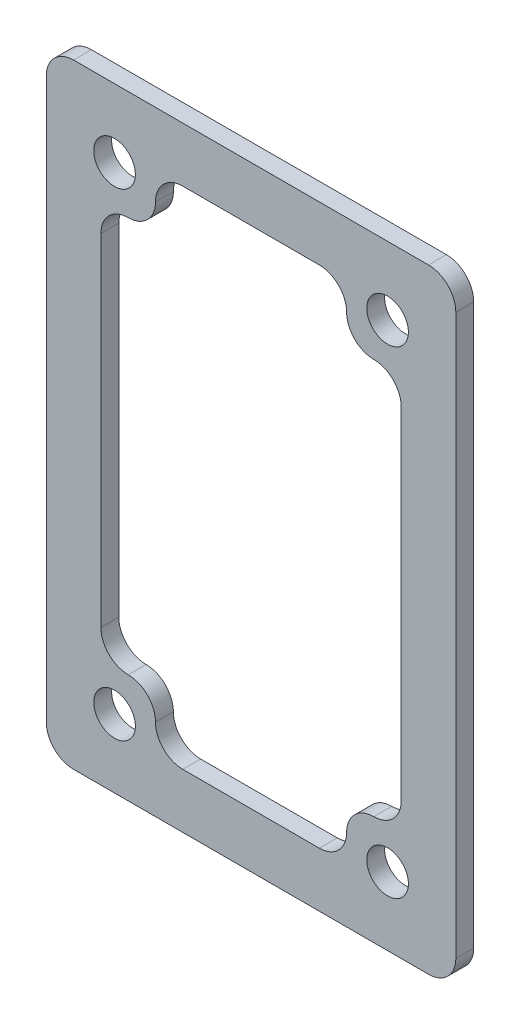
ISO-10303-21;
HEADER;
FILE_DESCRIPTION(('STEP AP214'),'2;1');
FILE_NAME('part.step','',(''),(''),'','','');
FILE_SCHEMA(('AUTOMOTIVE_DESIGN { 1 0 10303 214 1 1 1 1 }'));
ENDSEC;
DATA;
#1=APPLICATION_CONTEXT('core data for automotive mechanical design processes');
#2=APPLICATION_PROTOCOL_DEFINITION('international standard','automotive_design',2000,#1);
#3=PRODUCT_CONTEXT('',#1,'mechanical');
#4=PRODUCT('Part','Part','',(#3));
#5=PRODUCT_RELATED_PRODUCT_CATEGORY('part','',(#4));
#6=PRODUCT_DEFINITION_FORMATION('','',#4);
#7=PRODUCT_DEFINITION_CONTEXT('part definition',#1,'design');
#8=PRODUCT_DEFINITION('design','',#6,#7);
#9=PRODUCT_DEFINITION_SHAPE('','',#8);
#10=(LENGTH_UNIT() NAMED_UNIT(*) SI_UNIT(.MILLI.,.METRE.));
#11=(NAMED_UNIT(*) PLANE_ANGLE_UNIT() SI_UNIT($,.RADIAN.));
#12=(NAMED_UNIT(*) SI_UNIT($,.STERADIAN.) SOLID_ANGLE_UNIT());
#13=UNCERTAINTY_MEASURE_WITH_UNIT(LENGTH_MEASURE(1.E-05),#10,'distance_accuracy_value','');
#14=(GEOMETRIC_REPRESENTATION_CONTEXT(3) GLOBAL_UNCERTAINTY_ASSIGNED_CONTEXT((#13)) GLOBAL_UNIT_ASSIGNED_CONTEXT((#10,
#11,#12)) REPRESENTATION_CONTEXT('',''));
#15=CARTESIAN_POINT('',(0.,0.,0.));
#16=DIRECTION('',(0.,0.,1.));
#17=DIRECTION('',(1.,0.,0.));
#18=AXIS2_PLACEMENT_3D('',#15,#16,#17);
#19=CARTESIAN_POINT('',(15.,-22.5,1.31));
#20=DIRECTION('',(-1.,0.,0.));
#21=DIRECTION('',(0.,0.,1.));
#22=AXIS2_PLACEMENT_3D('',#19,#20,#21);
#23=PLANE('',#22);
#24=DIRECTION('',(0.,1.,0.));
#25=VECTOR('',#24,1.);
#26=CARTESIAN_POINT('',(15.,-22.5,1.31));
#27=LINE('',#26,#25);
#28=CARTESIAN_POINT('',(15.,-20.5,1.31));
#29=VERTEX_POINT('',#28);
#30=CARTESIAN_POINT('',(15.,20.5,1.31));
#31=VERTEX_POINT('',#30);
#32=EDGE_CURVE('E311',#29,#31,#27,.T.);
#33=ORIENTED_EDGE('',*,*,#32,.F.);
#34=DIRECTION('',(0.,0.,-1.));
#35=VECTOR('',#34,1.);
#36=CARTESIAN_POINT('',(15.,-20.5,1.31));
#37=LINE('',#36,#35);
#38=CARTESIAN_POINT('',(15.,-20.5,0.));
#39=VERTEX_POINT('',#38);
#40=EDGE_CURVE('E230',#29,#39,#37,.T.);
#41=ORIENTED_EDGE('',*,*,#40,.T.);
#42=DIRECTION('',(0.,1.,0.));
#43=VECTOR('',#42,1.);
#44=CARTESIAN_POINT('',(15.,-22.5,0.));
#45=LINE('',#44,#43);
#46=CARTESIAN_POINT('',(15.,20.5,0.));
#47=VERTEX_POINT('',#46);
#48=EDGE_CURVE('E301',#39,#47,#45,.T.);
#49=ORIENTED_EDGE('',*,*,#48,.T.);
#50=DIRECTION('',(0.,0.,-1.));
#51=VECTOR('',#50,1.);
#52=CARTESIAN_POINT('',(15.,20.5,1.31));
#53=LINE('',#52,#51);
#54=EDGE_CURVE('E227',#47,#31,#53,.F.);
#55=ORIENTED_EDGE('',*,*,#54,.T.);
#56=EDGE_LOOP('',(#33,#41,#49,#55));
#57=FACE_BOUND('',#56,.T.);
#58=ADVANCED_FACE('F35',(#57),#23,.F.);
#59=CARTESIAN_POINT('',(-15.,22.5,1.31));
#60=DIRECTION('',(0.,-1.,0.));
#61=DIRECTION('',(0.,0.,-1.));
#62=AXIS2_PLACEMENT_3D('',#59,#60,#61);
#63=PLANE('',#62);
#64=DIRECTION('',(-1.,0.,0.));
#65=VECTOR('',#64,1.);
#66=CARTESIAN_POINT('',(-15.,22.5,0.));
#67=LINE('',#66,#65);
#68=CARTESIAN_POINT('',(13.,22.5,0.));
#69=VERTEX_POINT('',#68);
#70=CARTESIAN_POINT('',(-13.,22.5,0.));
#71=VERTEX_POINT('',#70);
#72=EDGE_CURVE('E291',#69,#71,#67,.T.);
#73=ORIENTED_EDGE('',*,*,#72,.T.);
#74=DIRECTION('',(0.,0.,-1.));
#75=VECTOR('',#74,1.);
#76=CARTESIAN_POINT('',(-13.,22.5,1.31));
#77=LINE('',#76,#75);
#78=CARTESIAN_POINT('',(-13.,22.5,1.31));
#79=VERTEX_POINT('',#78);
#80=EDGE_CURVE('E11',#71,#79,#77,.F.);
#81=ORIENTED_EDGE('',*,*,#80,.T.);
#82=DIRECTION('',(-1.,0.,0.));
#83=VECTOR('',#82,1.);
#84=CARTESIAN_POINT('',(-15.,22.5,1.31));
#85=LINE('',#84,#83);
#86=CARTESIAN_POINT('',(13.,22.5,1.31));
#87=VERTEX_POINT('',#86);
#88=EDGE_CURVE('E293',#87,#79,#85,.T.);
#89=ORIENTED_EDGE('',*,*,#88,.F.);
#90=DIRECTION('',(0.,0.,-1.));
#91=VECTOR('',#90,1.);
#92=CARTESIAN_POINT('',(13.,22.5,1.31));
#93=LINE('',#92,#91);
#94=EDGE_CURVE('E43',#87,#69,#93,.T.);
#95=ORIENTED_EDGE('',*,*,#94,.T.);
#96=EDGE_LOOP('',(#73,#81,#89,#95));
#97=FACE_BOUND('',#96,.T.);
#98=ADVANCED_FACE('F290',(#97),#63,.F.);
#99=CARTESIAN_POINT('',(-15.,-22.5,1.31));
#100=DIRECTION('',(1.,0.,0.));
#101=DIRECTION('',(0.,0.,-1.));
#102=AXIS2_PLACEMENT_3D('',#99,#100,#101);
#103=PLANE('',#102);
#104=DIRECTION('',(0.,-1.,0.));
#105=VECTOR('',#104,1.);
#106=CARTESIAN_POINT('',(-15.,-22.5,0.));
#107=LINE('',#106,#105);
#108=CARTESIAN_POINT('',(-15.,20.5,0.));
#109=VERTEX_POINT('',#108);
#110=CARTESIAN_POINT('',(-15.,-20.5,0.));
#111=VERTEX_POINT('',#110);
#112=EDGE_CURVE('E300',#109,#111,#107,.T.);
#113=ORIENTED_EDGE('',*,*,#112,.T.);
#114=DIRECTION('',(0.,0.,-1.));
#115=VECTOR('',#114,1.);
#116=CARTESIAN_POINT('',(-15.,-20.5,1.31));
#117=LINE('',#116,#115);
#118=CARTESIAN_POINT('',(-15.,-20.5,1.31));
#119=VERTEX_POINT('',#118);
#120=EDGE_CURVE('E50',#111,#119,#117,.F.);
#121=ORIENTED_EDGE('',*,*,#120,.T.);
#122=DIRECTION('',(0.,-1.,0.));
#123=VECTOR('',#122,1.);
#124=CARTESIAN_POINT('',(-15.,-22.5,1.31));
#125=LINE('',#124,#123);
#126=CARTESIAN_POINT('',(-15.,20.5,1.31));
#127=VERTEX_POINT('',#126);
#128=EDGE_CURVE('E426',#127,#119,#125,.T.);
#129=ORIENTED_EDGE('',*,*,#128,.F.);
#130=DIRECTION('',(0.,0.,-1.));
#131=VECTOR('',#130,1.);
#132=CARTESIAN_POINT('',(-15.,20.5,1.31));
#133=LINE('',#132,#131);
#134=EDGE_CURVE('E281',#127,#109,#133,.T.);
#135=ORIENTED_EDGE('',*,*,#134,.T.);
#136=EDGE_LOOP('',(#113,#121,#129,#135));
#137=FACE_BOUND('',#136,.T.);
#138=ADVANCED_FACE('F444',(#137),#103,.F.);
#139=CARTESIAN_POINT('',(-15.,-22.5,1.31));
#140=DIRECTION('',(0.,1.,0.));
#141=DIRECTION('',(0.,0.,1.));
#142=AXIS2_PLACEMENT_3D('',#139,#140,#141);
#143=PLANE('',#142);
#144=DIRECTION('',(1.,0.,0.));
#145=VECTOR('',#144,1.);
#146=CARTESIAN_POINT('',(-15.,-22.5,0.));
#147=LINE('',#146,#145);
#148=CARTESIAN_POINT('',(-13.,-22.5,0.));
#149=VERTEX_POINT('',#148);
#150=CARTESIAN_POINT('',(13.,-22.5,0.));
#151=VERTEX_POINT('',#150);
#152=EDGE_CURVE('E303',#149,#151,#147,.T.);
#153=ORIENTED_EDGE('',*,*,#152,.T.);
#154=DIRECTION('',(0.,0.,-1.));
#155=VECTOR('',#154,1.);
#156=CARTESIAN_POINT('',(13.,-22.5,1.31));
#157=LINE('',#156,#155);
#158=CARTESIAN_POINT('',(13.,-22.5,1.31));
#159=VERTEX_POINT('',#158);
#160=EDGE_CURVE('E272',#151,#159,#157,.F.);
#161=ORIENTED_EDGE('',*,*,#160,.T.);
#162=DIRECTION('',(1.,0.,0.));
#163=VECTOR('',#162,1.);
#164=CARTESIAN_POINT('',(-15.,-22.5,1.31));
#165=LINE('',#164,#163);
#166=CARTESIAN_POINT('',(-13.,-22.5,1.31));
#167=VERTEX_POINT('',#166);
#168=EDGE_CURVE('E325',#167,#159,#165,.T.);
#169=ORIENTED_EDGE('',*,*,#168,.F.);
#170=DIRECTION('',(0.,0.,-1.));
#171=VECTOR('',#170,1.);
#172=CARTESIAN_POINT('',(-13.,-22.5,1.31));
#173=LINE('',#172,#171);
#174=EDGE_CURVE('E269',#167,#149,#173,.T.);
#175=ORIENTED_EDGE('',*,*,#174,.T.);
#176=EDGE_LOOP('',(#153,#161,#169,#175));
#177=FACE_BOUND('',#176,.T.);
#178=ADVANCED_FACE('F441',(#177),#143,.F.);
#179=CARTESIAN_POINT('',(0.,0.,1.31));
#180=DIRECTION('',(0.,0.,-1.));
#181=DIRECTION('',(-1.,0.,0.));
#182=AXIS2_PLACEMENT_3D('',#179,#180,#181);
#183=PLANE('',#182);
#184=DIRECTION('',(-1.,0.,0.));
#185=VECTOR('',#184,1.);
#186=CARTESIAN_POINT('',(-7.,18.5,1.31));
#187=LINE('',#186,#185);
#188=CARTESIAN_POINT('',(5.,18.5,1.31));
#189=VERTEX_POINT('',#188);
#190=CARTESIAN_POINT('',(-5.,18.5,1.31));
#191=VERTEX_POINT('',#190);
#192=EDGE_CURVE('E406',#189,#191,#187,.T.);
#193=ORIENTED_EDGE('',*,*,#192,.F.);
#194=CARTESIAN_POINT('',(5.,16.5,1.31));
#195=DIRECTION('',(0.,0.,-1.));
#196=DIRECTION('',(-1.,0.,0.));
#197=AXIS2_PLACEMENT_3D('',#194,#195,#196);
#198=CIRCLE('',#197,2.);
#199=CARTESIAN_POINT('',(7.,16.5,1.31));
#200=VERTEX_POINT('',#199);
#201=EDGE_CURVE('E374',#189,#200,#198,.T.);
#202=ORIENTED_EDGE('',*,*,#201,.T.);
#203=CARTESIAN_POINT('',(9.,16.5,1.31));
#204=DIRECTION('',(0.,0.,-1.));
#205=DIRECTION('',(-1.,0.,0.));
#206=AXIS2_PLACEMENT_3D('',#203,#204,#205);
#207=CIRCLE('',#206,2.);
#208=CARTESIAN_POINT('',(9.,14.5,1.31));
#209=VERTEX_POINT('',#208);
#210=EDGE_CURVE('E344',#200,#209,#207,.F.);
#211=ORIENTED_EDGE('',*,*,#210,.T.);
#212=CARTESIAN_POINT('',(9.,12.5,1.31));
#213=DIRECTION('',(0.,0.,-1.));
#214=DIRECTION('',(-1.,0.,0.));
#215=AXIS2_PLACEMENT_3D('',#212,#213,#214);
#216=CIRCLE('',#215,2.);
#217=CARTESIAN_POINT('',(11.,12.5,1.31));
#218=VERTEX_POINT('',#217);
#219=EDGE_CURVE('E370',#209,#218,#216,.T.);
#220=ORIENTED_EDGE('',*,*,#219,.T.);
#221=DIRECTION('',(0.,1.,0.));
#222=VECTOR('',#221,1.);
#223=CARTESIAN_POINT('',(11.,-14.5,1.31));
#224=LINE('',#223,#222);
#225=CARTESIAN_POINT('',(11.,-12.5,1.31));
#226=VERTEX_POINT('',#225);
#227=EDGE_CURVE('E242',#226,#218,#224,.T.);
#228=ORIENTED_EDGE('',*,*,#227,.F.);
#229=CARTESIAN_POINT('',(9.,-12.5,1.31));
#230=DIRECTION('',(0.,0.,-1.));
#231=DIRECTION('',(-1.,0.,0.));
#232=AXIS2_PLACEMENT_3D('',#229,#230,#231);
#233=CIRCLE('',#232,2.);
#234=CARTESIAN_POINT('',(9.,-14.5,1.31));
#235=VERTEX_POINT('',#234);
#236=EDGE_CURVE('E366',#226,#235,#233,.T.);
#237=ORIENTED_EDGE('',*,*,#236,.T.);
#238=CARTESIAN_POINT('',(9.,-16.5,1.31));
#239=DIRECTION('',(0.,0.,-1.));
#240=DIRECTION('',(-1.,0.,0.));
#241=AXIS2_PLACEMENT_3D('',#238,#239,#240);
#242=CIRCLE('',#241,2.);
#243=CARTESIAN_POINT('',(7.,-16.5,1.31));
#244=VERTEX_POINT('',#243);
#245=EDGE_CURVE('E338',#235,#244,#242,.F.);
#246=ORIENTED_EDGE('',*,*,#245,.T.);
#247=CARTESIAN_POINT('',(5.,-16.5,1.31));
#248=DIRECTION('',(0.,0.,-1.));
#249=DIRECTION('',(-1.,0.,0.));
#250=AXIS2_PLACEMENT_3D('',#247,#248,#249);
#251=CIRCLE('',#250,2.);
#252=CARTESIAN_POINT('',(5.,-18.5,1.31));
#253=VERTEX_POINT('',#252);
#254=EDGE_CURVE('E228',#244,#253,#251,.T.);
#255=ORIENTED_EDGE('',*,*,#254,.T.);
#256=DIRECTION('',(1.,0.,0.));
#257=VECTOR('',#256,1.);
#258=CARTESIAN_POINT('',(-6.99999999999999,-18.5,1.31));
#259=LINE('',#258,#257);
#260=CARTESIAN_POINT('',(-4.99999999999999,-18.5,1.31));
#261=VERTEX_POINT('',#260);
#262=EDGE_CURVE('E205',#261,#253,#259,.T.);
#263=ORIENTED_EDGE('',*,*,#262,.F.);
#264=CARTESIAN_POINT('',(-4.99999999999999,-16.5,1.31));
#265=DIRECTION('',(0.,0.,-1.));
#266=DIRECTION('',(-1.,0.,0.));
#267=AXIS2_PLACEMENT_3D('',#264,#265,#266);
#268=CIRCLE('',#267,2.);
#269=CARTESIAN_POINT('',(-6.99999999999999,-16.5,1.31));
#270=VERTEX_POINT('',#269);
#271=EDGE_CURVE('E363',#261,#270,#268,.T.);
#272=ORIENTED_EDGE('',*,*,#271,.T.);
#273=CARTESIAN_POINT('',(-8.99999999999999,-16.5,1.31));
#274=DIRECTION('',(0.,0.,-1.));
#275=DIRECTION('',(-1.,0.,0.));
#276=AXIS2_PLACEMENT_3D('',#273,#274,#275);
#277=CIRCLE('',#276,2.);
#278=CARTESIAN_POINT('',(-8.99999999999999,-14.5,1.31));
#279=VERTEX_POINT('',#278);
#280=EDGE_CURVE('E340',#270,#279,#277,.F.);
#281=ORIENTED_EDGE('',*,*,#280,.T.);
#282=CARTESIAN_POINT('',(-8.99999999999999,-12.5,1.31));
#283=DIRECTION('',(0.,0.,-1.));
#284=DIRECTION('',(-1.,0.,0.));
#285=AXIS2_PLACEMENT_3D('',#282,#283,#284);
#286=CIRCLE('',#285,2.);
#287=CARTESIAN_POINT('',(-11.,-12.5,1.31));
#288=VERTEX_POINT('',#287);
#289=EDGE_CURVE('E386',#279,#288,#286,.T.);
#290=ORIENTED_EDGE('',*,*,#289,.T.);
#291=DIRECTION('',(0.,-1.,0.));
#292=VECTOR('',#291,1.);
#293=CARTESIAN_POINT('',(-11.,-14.5,1.31));
#294=LINE('',#293,#292);
#295=CARTESIAN_POINT('',(-11.,12.5,1.31));
#296=VERTEX_POINT('',#295);
#297=EDGE_CURVE('E412',#296,#288,#294,.T.);
#298=ORIENTED_EDGE('',*,*,#297,.F.);
#299=CARTESIAN_POINT('',(-9.,12.5,1.31));
#300=DIRECTION('',(0.,0.,-1.));
#301=DIRECTION('',(-1.,0.,0.));
#302=AXIS2_PLACEMENT_3D('',#299,#300,#301);
#303=CIRCLE('',#302,2.);
#304=CARTESIAN_POINT('',(-9.,14.5,1.31));
#305=VERTEX_POINT('',#304);
#306=EDGE_CURVE('E382',#296,#305,#303,.T.);
#307=ORIENTED_EDGE('',*,*,#306,.T.);
#308=CARTESIAN_POINT('',(-9.,16.5,1.31));
#309=DIRECTION('',(0.,0.,-1.));
#310=DIRECTION('',(-1.,0.,0.));
#311=AXIS2_PLACEMENT_3D('',#308,#309,#310);
#312=CIRCLE('',#311,2.);
#313=CARTESIAN_POINT('',(-7.,16.5,1.31));
#314=VERTEX_POINT('',#313);
#315=EDGE_CURVE('E342',#305,#314,#312,.F.);
#316=ORIENTED_EDGE('',*,*,#315,.T.);
#317=CARTESIAN_POINT('',(-5.,16.5,1.31));
#318=DIRECTION('',(0.,0.,-1.));
#319=DIRECTION('',(-1.,0.,0.));
#320=AXIS2_PLACEMENT_3D('',#317,#318,#319);
#321=CIRCLE('',#320,2.);
#322=EDGE_CURVE('E378',#314,#191,#321,.T.);
#323=ORIENTED_EDGE('',*,*,#322,.T.);
#324=EDGE_LOOP('',(#193,#202,#211,#220,#228,#237,#246,#255,#263,#272,#281,#290,#298,#307,#316,#323));
#325=FACE_BOUND('',#324,.T.);
#326=CARTESIAN_POINT('',(10.,17.5,1.31));
#327=DIRECTION('',(0.,0.,1.));
#328=DIRECTION('',(1.,0.,0.));
#329=AXIS2_PLACEMENT_3D('',#326,#327,#328);
#330=CIRCLE('',#329,1.525);
#331=CARTESIAN_POINT('',(11.525,17.5,1.31));
#332=VERTEX_POINT('',#331);
#333=EDGE_CURVE('E416',#332,#332,#330,.T.);
#334=ORIENTED_EDGE('',*,*,#333,.F.);
#335=EDGE_LOOP('',(#334));
#336=FACE_BOUND('',#335,.T.);
#337=CARTESIAN_POINT('',(-9.99999999999999,-17.5,1.31));
#338=DIRECTION('',(0.,0.,1.));
#339=DIRECTION('',(1.,0.,0.));
#340=AXIS2_PLACEMENT_3D('',#337,#338,#339);
#341=CIRCLE('',#340,1.525);
#342=CARTESIAN_POINT('',(-8.47499999999999,-17.5,1.31));
#343=VERTEX_POINT('',#342);
#344=EDGE_CURVE('E409',#343,#343,#341,.T.);
#345=ORIENTED_EDGE('',*,*,#344,.F.);
#346=EDGE_LOOP('',(#345));
#347=FACE_BOUND('',#346,.T.);
#348=CARTESIAN_POINT('',(10.,-17.5,1.31));
#349=DIRECTION('',(0.,0.,1.));
#350=DIRECTION('',(1.,0.,0.));
#351=AXIS2_PLACEMENT_3D('',#348,#349,#350);
#352=CIRCLE('',#351,1.525);
#353=CARTESIAN_POINT('',(11.525,-17.5,1.31));
#354=VERTEX_POINT('',#353);
#355=EDGE_CURVE('E405',#354,#354,#352,.T.);
#356=ORIENTED_EDGE('',*,*,#355,.F.);
#357=EDGE_LOOP('',(#356));
#358=FACE_BOUND('',#357,.T.);
#359=CARTESIAN_POINT('',(-10.,17.5,1.31));
#360=DIRECTION('',(0.,0.,1.));
#361=DIRECTION('',(1.,0.,0.));
#362=AXIS2_PLACEMENT_3D('',#359,#360,#361);
#363=CIRCLE('',#362,1.525);
#364=CARTESIAN_POINT('',(-8.475,17.5,1.31));
#365=VERTEX_POINT('',#364);
#366=EDGE_CURVE('E316',#365,#365,#363,.T.);
#367=ORIENTED_EDGE('',*,*,#366,.F.);
#368=EDGE_LOOP('',(#367));
#369=FACE_BOUND('',#368,.T.);
#370=ORIENTED_EDGE('',*,*,#168,.T.);
#371=CARTESIAN_POINT('',(13.,-20.5,1.31));
#372=DIRECTION('',(0.,0.,-1.));
#373=DIRECTION('',(-1.,0.,0.));
#374=AXIS2_PLACEMENT_3D('',#371,#372,#373);
#375=CIRCLE('',#374,2.);
#376=EDGE_CURVE('E279',#159,#29,#375,.F.);
#377=ORIENTED_EDGE('',*,*,#376,.T.);
#378=ORIENTED_EDGE('',*,*,#32,.T.);
#379=CARTESIAN_POINT('',(13.,20.5,1.31));
#380=DIRECTION('',(0.,0.,-1.));
#381=DIRECTION('',(-1.,0.,0.));
#382=AXIS2_PLACEMENT_3D('',#379,#380,#381);
#383=CIRCLE('',#382,2.);
#384=EDGE_CURVE('E274',#31,#87,#383,.F.);
#385=ORIENTED_EDGE('',*,*,#384,.T.);
#386=ORIENTED_EDGE('',*,*,#88,.T.);
#387=CARTESIAN_POINT('',(-13.,20.5,1.31));
#388=DIRECTION('',(0.,0.,-1.));
#389=DIRECTION('',(-1.,0.,0.));
#390=AXIS2_PLACEMENT_3D('',#387,#388,#389);
#391=CIRCLE('',#390,2.);
#392=EDGE_CURVE('E57',#79,#127,#391,.F.);
#393=ORIENTED_EDGE('',*,*,#392,.T.);
#394=ORIENTED_EDGE('',*,*,#128,.T.);
#395=CARTESIAN_POINT('',(-13.,-20.5,1.31));
#396=DIRECTION('',(0.,0.,-1.));
#397=DIRECTION('',(-1.,0.,0.));
#398=AXIS2_PLACEMENT_3D('',#395,#396,#397);
#399=CIRCLE('',#398,2.);
#400=EDGE_CURVE('E277',#119,#167,#399,.F.);
#401=ORIENTED_EDGE('',*,*,#400,.T.);
#402=EDGE_LOOP('',(#370,#377,#378,#385,#386,#393,#394,#401));
#403=FACE_BOUND('',#402,.T.);
#404=ADVANCED_FACE('F403',(#325,#336,#347,#358,#369,#403),#183,.F.);
#405=CARTESIAN_POINT('',(0.,0.,0.));
#406=DIRECTION('',(0.,0.,-1.));
#407=DIRECTION('',(-1.,0.,0.));
#408=AXIS2_PLACEMENT_3D('',#405,#406,#407);
#409=PLANE('',#408);
#410=DIRECTION('',(0.,-1.,0.));
#411=VECTOR('',#410,1.);
#412=CARTESIAN_POINT('',(11.,0.,0.));
#413=LINE('',#412,#411);
#414=CARTESIAN_POINT('',(11.,12.5,0.));
#415=VERTEX_POINT('',#414);
#416=CARTESIAN_POINT('',(11.,-12.5,0.));
#417=VERTEX_POINT('',#416);
#418=EDGE_CURVE('E220',#415,#417,#413,.T.);
#419=ORIENTED_EDGE('',*,*,#418,.F.);
#420=CARTESIAN_POINT('',(9.,12.5,0.));
#421=DIRECTION('',(0.,0.,-1.));
#422=DIRECTION('',(-1.,0.,0.));
#423=AXIS2_PLACEMENT_3D('',#420,#421,#422);
#424=CIRCLE('',#423,2.);
#425=CARTESIAN_POINT('',(9.,14.5,0.));
#426=VERTEX_POINT('',#425);
#427=EDGE_CURVE('E372',#415,#426,#424,.F.);
#428=ORIENTED_EDGE('',*,*,#427,.T.);
#429=CARTESIAN_POINT('',(9.,16.5,0.));
#430=DIRECTION('',(0.,0.,-1.));
#431=DIRECTION('',(-1.,0.,0.));
#432=AXIS2_PLACEMENT_3D('',#429,#430,#431);
#433=CIRCLE('',#432,2.);
#434=CARTESIAN_POINT('',(7.,16.5,0.));
#435=VERTEX_POINT('',#434);
#436=EDGE_CURVE('E352',#426,#435,#433,.T.);
#437=ORIENTED_EDGE('',*,*,#436,.T.);
#438=CARTESIAN_POINT('',(5.,16.5,0.));
#439=DIRECTION('',(0.,0.,-1.));
#440=DIRECTION('',(-1.,0.,0.));
#441=AXIS2_PLACEMENT_3D('',#438,#439,#440);
#442=CIRCLE('',#441,2.);
#443=CARTESIAN_POINT('',(5.,18.5,0.));
#444=VERTEX_POINT('',#443);
#445=EDGE_CURVE('E376',#435,#444,#442,.F.);
#446=ORIENTED_EDGE('',*,*,#445,.T.);
#447=DIRECTION('',(1.,0.,0.));
#448=VECTOR('',#447,1.);
#449=CARTESIAN_POINT('',(0.,18.5,0.));
#450=LINE('',#449,#448);
#451=CARTESIAN_POINT('',(-5.,18.5,0.));
#452=VERTEX_POINT('',#451);
#453=EDGE_CURVE('E221',#452,#444,#450,.T.);
#454=ORIENTED_EDGE('',*,*,#453,.F.);
#455=CARTESIAN_POINT('',(-5.,16.5,0.));
#456=DIRECTION('',(0.,0.,-1.));
#457=DIRECTION('',(-1.,0.,0.));
#458=AXIS2_PLACEMENT_3D('',#455,#456,#457);
#459=CIRCLE('',#458,2.);
#460=CARTESIAN_POINT('',(-7.,16.5,0.));
#461=VERTEX_POINT('',#460);
#462=EDGE_CURVE('E380',#452,#461,#459,.F.);
#463=ORIENTED_EDGE('',*,*,#462,.T.);
#464=CARTESIAN_POINT('',(-9.,16.5,0.));
#465=DIRECTION('',(0.,0.,-1.));
#466=DIRECTION('',(-1.,0.,0.));
#467=AXIS2_PLACEMENT_3D('',#464,#465,#466);
#468=CIRCLE('',#467,2.);
#469=CARTESIAN_POINT('',(-9.,14.5,0.));
#470=VERTEX_POINT('',#469);
#471=EDGE_CURVE('E350',#461,#470,#468,.T.);
#472=ORIENTED_EDGE('',*,*,#471,.T.);
#473=CARTESIAN_POINT('',(-9.,12.5,0.));
#474=DIRECTION('',(0.,0.,-1.));
#475=DIRECTION('',(-1.,0.,0.));
#476=AXIS2_PLACEMENT_3D('',#473,#474,#475);
#477=CIRCLE('',#476,2.);
#478=CARTESIAN_POINT('',(-11.,12.5,0.));
#479=VERTEX_POINT('',#478);
#480=EDGE_CURVE('E384',#470,#479,#477,.F.);
#481=ORIENTED_EDGE('',*,*,#480,.T.);
#482=DIRECTION('',(0.,1.,0.));
#483=VECTOR('',#482,1.);
#484=CARTESIAN_POINT('',(-11.,0.,0.));
#485=LINE('',#484,#483);
#486=CARTESIAN_POINT('',(-11.,-12.5,0.));
#487=VERTEX_POINT('',#486);
#488=EDGE_CURVE('E210',#487,#479,#485,.T.);
#489=ORIENTED_EDGE('',*,*,#488,.F.);
#490=CARTESIAN_POINT('',(-8.99999999999999,-12.5,0.));
#491=DIRECTION('',(0.,0.,-1.));
#492=DIRECTION('',(-1.,0.,0.));
#493=AXIS2_PLACEMENT_3D('',#490,#491,#492);
#494=CIRCLE('',#493,2.);
#495=CARTESIAN_POINT('',(-8.99999999999999,-14.5,0.));
#496=VERTEX_POINT('',#495);
#497=EDGE_CURVE('E232',#487,#496,#494,.F.);
#498=ORIENTED_EDGE('',*,*,#497,.T.);
#499=CARTESIAN_POINT('',(-8.99999999999999,-16.5,0.));
#500=DIRECTION('',(0.,0.,-1.));
#501=DIRECTION('',(-1.,0.,0.));
#502=AXIS2_PLACEMENT_3D('',#499,#500,#501);
#503=CIRCLE('',#502,2.);
#504=CARTESIAN_POINT('',(-6.99999999999999,-16.5,0.));
#505=VERTEX_POINT('',#504);
#506=EDGE_CURVE('E348',#496,#505,#503,.T.);
#507=ORIENTED_EDGE('',*,*,#506,.T.);
#508=CARTESIAN_POINT('',(-4.99999999999999,-16.5,0.));
#509=DIRECTION('',(0.,0.,-1.));
#510=DIRECTION('',(-1.,0.,0.));
#511=AXIS2_PLACEMENT_3D('',#508,#509,#510);
#512=CIRCLE('',#511,2.);
#513=CARTESIAN_POINT('',(-4.99999999999999,-18.5,0.));
#514=VERTEX_POINT('',#513);
#515=EDGE_CURVE('E219',#505,#514,#512,.F.);
#516=ORIENTED_EDGE('',*,*,#515,.T.);
#517=DIRECTION('',(-1.,0.,0.));
#518=VECTOR('',#517,1.);
#519=CARTESIAN_POINT('',(0.,-18.5,0.));
#520=LINE('',#519,#518);
#521=CARTESIAN_POINT('',(5.,-18.5,0.));
#522=VERTEX_POINT('',#521);
#523=EDGE_CURVE('E202',#522,#514,#520,.T.);
#524=ORIENTED_EDGE('',*,*,#523,.F.);
#525=CARTESIAN_POINT('',(5.,-16.5,0.));
#526=DIRECTION('',(0.,0.,-1.));
#527=DIRECTION('',(-1.,0.,0.));
#528=AXIS2_PLACEMENT_3D('',#525,#526,#527);
#529=CIRCLE('',#528,2.);
#530=CARTESIAN_POINT('',(7.,-16.5,0.));
#531=VERTEX_POINT('',#530);
#532=EDGE_CURVE('E216',#522,#531,#529,.F.);
#533=ORIENTED_EDGE('',*,*,#532,.T.);
#534=CARTESIAN_POINT('',(9.,-16.5,0.));
#535=DIRECTION('',(0.,0.,-1.));
#536=DIRECTION('',(-1.,0.,0.));
#537=AXIS2_PLACEMENT_3D('',#534,#535,#536);
#538=CIRCLE('',#537,2.);
#539=CARTESIAN_POINT('',(9.,-14.5,0.));
#540=VERTEX_POINT('',#539);
#541=EDGE_CURVE('E346',#531,#540,#538,.T.);
#542=ORIENTED_EDGE('',*,*,#541,.T.);
#543=CARTESIAN_POINT('',(9.,-12.5,0.));
#544=DIRECTION('',(0.,0.,-1.));
#545=DIRECTION('',(-1.,0.,0.));
#546=AXIS2_PLACEMENT_3D('',#543,#544,#545);
#547=CIRCLE('',#546,2.);
#548=EDGE_CURVE('E368',#540,#417,#547,.F.);
#549=ORIENTED_EDGE('',*,*,#548,.T.);
#550=EDGE_LOOP('',(#419,#428,#437,#446,#454,#463,#472,#481,#489,#498,#507,#516,#524,#533,#542,#549));
#551=FACE_BOUND('',#550,.T.);
#552=CARTESIAN_POINT('',(10.,17.5,0.));
#553=DIRECTION('',(0.,0.,-1.));
#554=DIRECTION('',(-1.,0.,0.));
#555=AXIS2_PLACEMENT_3D('',#552,#553,#554);
#556=CIRCLE('',#555,1.525);
#557=CARTESIAN_POINT('',(8.475,17.5,0.));
#558=VERTEX_POINT('',#557);
#559=EDGE_CURVE('E305',#558,#558,#556,.T.);
#560=ORIENTED_EDGE('',*,*,#559,.F.);
#561=EDGE_LOOP('',(#560));
#562=FACE_BOUND('',#561,.T.);
#563=CARTESIAN_POINT('',(-9.99999999999999,-17.5,0.));
#564=DIRECTION('',(0.,0.,-1.));
#565=DIRECTION('',(-1.,0.,0.));
#566=AXIS2_PLACEMENT_3D('',#563,#564,#565);
#567=CIRCLE('',#566,1.525);
#568=CARTESIAN_POINT('',(-11.525,-17.5,0.));
#569=VERTEX_POINT('',#568);
#570=EDGE_CURVE('E319',#569,#569,#567,.T.);
#571=ORIENTED_EDGE('',*,*,#570,.F.);
#572=EDGE_LOOP('',(#571));
#573=FACE_BOUND('',#572,.T.);
#574=CARTESIAN_POINT('',(10.,-17.5,0.));
#575=DIRECTION('',(0.,0.,-1.));
#576=DIRECTION('',(-1.,0.,0.));
#577=AXIS2_PLACEMENT_3D('',#574,#575,#576);
#578=CIRCLE('',#577,1.525);
#579=CARTESIAN_POINT('',(8.475,-17.5,0.));
#580=VERTEX_POINT('',#579);
#581=EDGE_CURVE('E315',#580,#580,#578,.T.);
#582=ORIENTED_EDGE('',*,*,#581,.F.);
#583=EDGE_LOOP('',(#582));
#584=FACE_BOUND('',#583,.T.);
#585=CARTESIAN_POINT('',(-10.,17.5,0.));
#586=DIRECTION('',(0.,0.,-1.));
#587=DIRECTION('',(-1.,0.,0.));
#588=AXIS2_PLACEMENT_3D('',#585,#586,#587);
#589=CIRCLE('',#588,1.525);
#590=CARTESIAN_POINT('',(-11.525,17.5,0.));
#591=VERTEX_POINT('',#590);
#592=EDGE_CURVE('E312',#591,#591,#589,.T.);
#593=ORIENTED_EDGE('',*,*,#592,.F.);
#594=EDGE_LOOP('',(#593));
#595=FACE_BOUND('',#594,.T.);
#596=ORIENTED_EDGE('',*,*,#48,.F.);
#597=CARTESIAN_POINT('',(13.,-20.5,0.));
#598=DIRECTION('',(0.,0.,-1.));
#599=DIRECTION('',(-1.,0.,0.));
#600=AXIS2_PLACEMENT_3D('',#597,#598,#599);
#601=CIRCLE('',#600,2.);
#602=EDGE_CURVE('E267',#39,#151,#601,.T.);
#603=ORIENTED_EDGE('',*,*,#602,.T.);
#604=ORIENTED_EDGE('',*,*,#152,.F.);
#605=CARTESIAN_POINT('',(-13.,-20.5,0.));
#606=DIRECTION('',(0.,0.,-1.));
#607=DIRECTION('',(-1.,0.,0.));
#608=AXIS2_PLACEMENT_3D('',#605,#606,#607);
#609=CIRCLE('',#608,2.);
#610=EDGE_CURVE('E265',#149,#111,#609,.T.);
#611=ORIENTED_EDGE('',*,*,#610,.T.);
#612=ORIENTED_EDGE('',*,*,#112,.F.);
#613=CARTESIAN_POINT('',(-13.,20.5,0.));
#614=DIRECTION('',(0.,0.,-1.));
#615=DIRECTION('',(-1.,0.,0.));
#616=AXIS2_PLACEMENT_3D('',#613,#614,#615);
#617=CIRCLE('',#616,2.);
#618=EDGE_CURVE('E263',#109,#71,#617,.T.);
#619=ORIENTED_EDGE('',*,*,#618,.T.);
#620=ORIENTED_EDGE('',*,*,#72,.F.);
#621=CARTESIAN_POINT('',(13.,20.5,0.));
#622=DIRECTION('',(0.,0.,-1.));
#623=DIRECTION('',(-1.,0.,0.));
#624=AXIS2_PLACEMENT_3D('',#621,#622,#623);
#625=CIRCLE('',#624,2.);
#626=EDGE_CURVE('E261',#69,#47,#625,.T.);
#627=ORIENTED_EDGE('',*,*,#626,.T.);
#628=EDGE_LOOP('',(#596,#603,#604,#611,#612,#619,#620,#627));
#629=FACE_BOUND('',#628,.T.);
#630=ADVANCED_FACE('F214',(#551,#562,#573,#584,#595,#629),#409,.T.);
#631=CARTESIAN_POINT('',(-10.,17.5,-8.69));
#632=DIRECTION('',(0.,0.,1.));
#633=DIRECTION('',(1.,0.,0.));
#634=AXIS2_PLACEMENT_3D('',#631,#632,#633);
#635=CYLINDRICAL_SURFACE('',#634,1.525);
#636=ORIENTED_EDGE('',*,*,#592,.T.);
#637=EDGE_LOOP('',(#636));
#638=FACE_BOUND('',#637,.T.);
#639=ORIENTED_EDGE('',*,*,#366,.T.);
#640=EDGE_LOOP('',(#639));
#641=FACE_BOUND('',#640,.T.);
#642=ADVANCED_FACE('F645',(#638,#641),#635,.F.);
#643=CARTESIAN_POINT('',(10.,-17.5,-8.69));
#644=DIRECTION('',(0.,0.,1.));
#645=DIRECTION('',(1.,0.,0.));
#646=AXIS2_PLACEMENT_3D('',#643,#644,#645);
#647=CYLINDRICAL_SURFACE('',#646,1.525);
#648=ORIENTED_EDGE('',*,*,#581,.T.);
#649=EDGE_LOOP('',(#648));
#650=FACE_BOUND('',#649,.T.);
#651=ORIENTED_EDGE('',*,*,#355,.T.);
#652=EDGE_LOOP('',(#651));
#653=FACE_BOUND('',#652,.T.);
#654=ADVANCED_FACE('F636',(#650,#653),#647,.F.);
#655=CARTESIAN_POINT('',(-9.99999999999999,-17.5,-8.69));
#656=DIRECTION('',(0.,0.,1.));
#657=DIRECTION('',(1.,0.,0.));
#658=AXIS2_PLACEMENT_3D('',#655,#656,#657);
#659=CYLINDRICAL_SURFACE('',#658,1.525);
#660=ORIENTED_EDGE('',*,*,#570,.T.);
#661=EDGE_LOOP('',(#660));
#662=FACE_BOUND('',#661,.T.);
#663=ORIENTED_EDGE('',*,*,#344,.T.);
#664=EDGE_LOOP('',(#663));
#665=FACE_BOUND('',#664,.T.);
#666=ADVANCED_FACE('F627',(#662,#665),#659,.F.);
#667=CARTESIAN_POINT('',(10.,17.5,-8.69));
#668=DIRECTION('',(0.,0.,1.));
#669=DIRECTION('',(1.,0.,0.));
#670=AXIS2_PLACEMENT_3D('',#667,#668,#669);
#671=CYLINDRICAL_SURFACE('',#670,1.525);
#672=ORIENTED_EDGE('',*,*,#559,.T.);
#673=EDGE_LOOP('',(#672));
#674=FACE_BOUND('',#673,.T.);
#675=ORIENTED_EDGE('',*,*,#333,.T.);
#676=EDGE_LOOP('',(#675));
#677=FACE_BOUND('',#676,.T.);
#678=ADVANCED_FACE('F619',(#674,#677),#671,.F.);
#679=CARTESIAN_POINT('',(-6.99999999999999,-18.5,-8.69));
#680=DIRECTION('',(0.,-1.,0.));
#681=DIRECTION('',(0.,0.,-1.));
#682=AXIS2_PLACEMENT_3D('',#679,#680,#681);
#683=PLANE('',#682);
#684=ORIENTED_EDGE('',*,*,#523,.T.);
#685=DIRECTION('',(0.,0.,1.));
#686=VECTOR('',#685,1.);
#687=CARTESIAN_POINT('',(-4.99999999999999,-18.5,1.31));
#688=LINE('',#687,#686);
#689=EDGE_CURVE('E209',#514,#261,#688,.T.);
#690=ORIENTED_EDGE('',*,*,#689,.T.);
#691=ORIENTED_EDGE('',*,*,#262,.T.);
#692=DIRECTION('',(0.,0.,1.));
#693=VECTOR('',#692,1.);
#694=CARTESIAN_POINT('',(5.,-18.5,0.));
#695=LINE('',#694,#693);
#696=EDGE_CURVE('E198',#253,#522,#695,.F.);
#697=ORIENTED_EDGE('',*,*,#696,.T.);
#698=EDGE_LOOP('',(#684,#690,#691,#697));
#699=FACE_BOUND('',#698,.T.);
#700=ADVANCED_FACE('F200',(#699),#683,.F.);
#701=CARTESIAN_POINT('',(-7.,18.5,-8.69));
#702=DIRECTION('',(0.,1.,0.));
#703=DIRECTION('',(0.,0.,1.));
#704=AXIS2_PLACEMENT_3D('',#701,#702,#703);
#705=PLANE('',#704);
#706=ORIENTED_EDGE('',*,*,#453,.T.);
#707=DIRECTION('',(0.,0.,1.));
#708=VECTOR('',#707,1.);
#709=CARTESIAN_POINT('',(5.,18.5,1.31));
#710=LINE('',#709,#708);
#711=EDGE_CURVE('E357',#444,#189,#710,.T.);
#712=ORIENTED_EDGE('',*,*,#711,.T.);
#713=ORIENTED_EDGE('',*,*,#192,.T.);
#714=DIRECTION('',(0.,0.,1.));
#715=VECTOR('',#714,1.);
#716=CARTESIAN_POINT('',(-5.,18.5,0.));
#717=LINE('',#716,#715);
#718=EDGE_CURVE('E354',#191,#452,#717,.F.);
#719=ORIENTED_EDGE('',*,*,#718,.T.);
#720=EDGE_LOOP('',(#706,#712,#713,#719));
#721=FACE_BOUND('',#720,.T.);
#722=ADVANCED_FACE('F602',(#721),#705,.F.);
#723=CARTESIAN_POINT('',(-11.,-14.5,-8.69));
#724=DIRECTION('',(-1.,0.,0.));
#725=DIRECTION('',(0.,-1.,0.));
#726=AXIS2_PLACEMENT_3D('',#723,#724,#725);
#727=PLANE('',#726);
#728=ORIENTED_EDGE('',*,*,#488,.T.);
#729=DIRECTION('',(0.,0.,1.));
#730=VECTOR('',#729,1.);
#731=CARTESIAN_POINT('',(-11.,12.5,1.31));
#732=LINE('',#731,#730);
#733=EDGE_CURVE('E361',#479,#296,#732,.T.);
#734=ORIENTED_EDGE('',*,*,#733,.T.);
#735=ORIENTED_EDGE('',*,*,#297,.T.);
#736=DIRECTION('',(0.,0.,1.));
#737=VECTOR('',#736,1.);
#738=CARTESIAN_POINT('',(-11.,-12.5,0.));
#739=LINE('',#738,#737);
#740=EDGE_CURVE('E359',#288,#487,#739,.F.);
#741=ORIENTED_EDGE('',*,*,#740,.T.);
#742=EDGE_LOOP('',(#728,#734,#735,#741));
#743=FACE_BOUND('',#742,.T.);
#744=ADVANCED_FACE('F593',(#743),#727,.F.);
#745=CARTESIAN_POINT('',(11.,-14.5,-8.69));
#746=DIRECTION('',(1.,0.,0.));
#747=DIRECTION('',(0.,0.,-1.));
#748=AXIS2_PLACEMENT_3D('',#745,#746,#747);
#749=PLANE('',#748);
#750=ORIENTED_EDGE('',*,*,#418,.T.);
#751=DIRECTION('',(0.,0.,1.));
#752=VECTOR('',#751,1.);
#753=CARTESIAN_POINT('',(11.,-12.5,1.31));
#754=LINE('',#753,#752);
#755=EDGE_CURVE('E335',#417,#226,#754,.T.);
#756=ORIENTED_EDGE('',*,*,#755,.T.);
#757=ORIENTED_EDGE('',*,*,#227,.T.);
#758=DIRECTION('',(0.,0.,1.));
#759=VECTOR('',#758,1.);
#760=CARTESIAN_POINT('',(11.,12.5,0.));
#761=LINE('',#760,#759);
#762=EDGE_CURVE('E332',#218,#415,#761,.F.);
#763=ORIENTED_EDGE('',*,*,#762,.T.);
#764=EDGE_LOOP('',(#750,#756,#757,#763));
#765=FACE_BOUND('',#764,.T.);
#766=ADVANCED_FACE('F466',(#765),#749,.F.);
#767=CARTESIAN_POINT('',(-8.99999999999999,-12.5,-8.69));
#768=DIRECTION('',(0.,0.,-1.));
#769=DIRECTION('',(-1.,0.,0.));
#770=AXIS2_PLACEMENT_3D('',#767,#768,#769);
#771=CYLINDRICAL_SURFACE('',#770,2.);
#772=ORIENTED_EDGE('',*,*,#740,.F.);
#773=ORIENTED_EDGE('',*,*,#289,.F.);
#774=DIRECTION('',(0.,0.,1.));
#775=VECTOR('',#774,1.);
#776=CARTESIAN_POINT('',(-8.99999999999999,-14.5,1.31));
#777=LINE('',#776,#775);
#778=EDGE_CURVE('E239',#496,#279,#777,.T.);
#779=ORIENTED_EDGE('',*,*,#778,.F.);
#780=ORIENTED_EDGE('',*,*,#497,.F.);
#781=EDGE_LOOP('',(#772,#773,#779,#780));
#782=FACE_BOUND('',#781,.T.);
#783=ADVANCED_FACE('F395',(#782),#771,.F.);
#784=CARTESIAN_POINT('',(-8.99999999999999,-16.5,-8.69));
#785=DIRECTION('',(0.,0.,1.));
#786=DIRECTION('',(1.,0.,0.));
#787=AXIS2_PLACEMENT_3D('',#784,#785,#786);
#788=CYLINDRICAL_SURFACE('',#787,2.);
#789=DIRECTION('',(0.,0.,1.));
#790=VECTOR('',#789,1.);
#791=CARTESIAN_POINT('',(-6.99999999999999,-16.5,-8.69));
#792=LINE('',#791,#790);
#793=EDGE_CURVE('E236',#505,#270,#792,.T.);
#794=ORIENTED_EDGE('',*,*,#793,.F.);
#795=ORIENTED_EDGE('',*,*,#506,.F.);
#796=ORIENTED_EDGE('',*,*,#778,.T.);
#797=ORIENTED_EDGE('',*,*,#280,.F.);
#798=EDGE_LOOP('',(#794,#795,#796,#797));
#799=FACE_BOUND('',#798,.T.);
#800=ADVANCED_FACE('F398',(#799),#788,.T.);
#801=CARTESIAN_POINT('',(-4.99999999999999,-16.5,-8.69));
#802=DIRECTION('',(0.,0.,-1.));
#803=DIRECTION('',(-1.,0.,0.));
#804=AXIS2_PLACEMENT_3D('',#801,#802,#803);
#805=CYLINDRICAL_SURFACE('',#804,2.);
#806=ORIENTED_EDGE('',*,*,#515,.F.);
#807=ORIENTED_EDGE('',*,*,#793,.T.);
#808=ORIENTED_EDGE('',*,*,#271,.F.);
#809=ORIENTED_EDGE('',*,*,#689,.F.);
#810=EDGE_LOOP('',(#806,#807,#808,#809));
#811=FACE_BOUND('',#810,.T.);
#812=ADVANCED_FACE('F400',(#811),#805,.F.);
#813=CARTESIAN_POINT('',(5.,-16.5,-8.69));
#814=DIRECTION('',(0.,0.,-1.));
#815=DIRECTION('',(-1.,0.,0.));
#816=AXIS2_PLACEMENT_3D('',#813,#814,#815);
#817=CYLINDRICAL_SURFACE('',#816,2.);
#818=ORIENTED_EDGE('',*,*,#696,.F.);
#819=ORIENTED_EDGE('',*,*,#254,.F.);
#820=DIRECTION('',(0.,0.,1.));
#821=VECTOR('',#820,1.);
#822=CARTESIAN_POINT('',(7.,-16.5,1.31));
#823=LINE('',#822,#821);
#824=EDGE_CURVE('E225',#531,#244,#823,.T.);
#825=ORIENTED_EDGE('',*,*,#824,.F.);
#826=ORIENTED_EDGE('',*,*,#532,.F.);
#827=EDGE_LOOP('',(#818,#819,#825,#826));
#828=FACE_BOUND('',#827,.T.);
#829=ADVANCED_FACE('F223',(#828),#817,.F.);
#830=CARTESIAN_POINT('',(9.,-16.5,-8.69));
#831=DIRECTION('',(0.,0.,-1.));
#832=DIRECTION('',(-1.,0.,0.));
#833=AXIS2_PLACEMENT_3D('',#830,#831,#832);
#834=CYLINDRICAL_SURFACE('',#833,2.);
#835=DIRECTION('',(0.,0.,-1.));
#836=VECTOR('',#835,1.);
#837=CARTESIAN_POINT('',(9.,-14.5,-8.69));
#838=LINE('',#837,#836);
#839=EDGE_CURVE('E243',#540,#235,#838,.F.);
#840=ORIENTED_EDGE('',*,*,#839,.F.);
#841=ORIENTED_EDGE('',*,*,#541,.F.);
#842=ORIENTED_EDGE('',*,*,#824,.T.);
#843=ORIENTED_EDGE('',*,*,#245,.F.);
#844=EDGE_LOOP('',(#840,#841,#842,#843));
#845=FACE_BOUND('',#844,.T.);
#846=ADVANCED_FACE('F471',(#845),#834,.T.);
#847=CARTESIAN_POINT('',(9.,-12.5,-8.69));
#848=DIRECTION('',(0.,0.,-1.));
#849=DIRECTION('',(-1.,0.,0.));
#850=AXIS2_PLACEMENT_3D('',#847,#848,#849);
#851=CYLINDRICAL_SURFACE('',#850,2.);
#852=ORIENTED_EDGE('',*,*,#548,.F.);
#853=ORIENTED_EDGE('',*,*,#839,.T.);
#854=ORIENTED_EDGE('',*,*,#236,.F.);
#855=ORIENTED_EDGE('',*,*,#755,.F.);
#856=EDGE_LOOP('',(#852,#853,#854,#855));
#857=FACE_BOUND('',#856,.T.);
#858=ADVANCED_FACE('F467',(#857),#851,.F.);
#859=CARTESIAN_POINT('',(5.,16.5,-8.69));
#860=DIRECTION('',(0.,0.,-1.));
#861=DIRECTION('',(-1.,0.,0.));
#862=AXIS2_PLACEMENT_3D('',#859,#860,#861);
#863=CYLINDRICAL_SURFACE('',#862,2.);
#864=ORIENTED_EDGE('',*,*,#711,.F.);
#865=ORIENTED_EDGE('',*,*,#445,.F.);
#866=DIRECTION('',(0.,0.,1.));
#867=VECTOR('',#866,1.);
#868=CARTESIAN_POINT('',(7.,16.5,0.));
#869=LINE('',#868,#867);
#870=EDGE_CURVE('E246',#200,#435,#869,.F.);
#871=ORIENTED_EDGE('',*,*,#870,.F.);
#872=ORIENTED_EDGE('',*,*,#201,.F.);
#873=EDGE_LOOP('',(#864,#865,#871,#872));
#874=FACE_BOUND('',#873,.T.);
#875=ADVANCED_FACE('F470',(#874),#863,.F.);
#876=CARTESIAN_POINT('',(9.,16.5,-8.69));
#877=DIRECTION('',(0.,0.,1.));
#878=DIRECTION('',(1.,0.,0.));
#879=AXIS2_PLACEMENT_3D('',#876,#877,#878);
#880=CYLINDRICAL_SURFACE('',#879,2.);
#881=ORIENTED_EDGE('',*,*,#870,.T.);
#882=ORIENTED_EDGE('',*,*,#436,.F.);
#883=DIRECTION('',(0.,0.,1.));
#884=VECTOR('',#883,1.);
#885=CARTESIAN_POINT('',(9.,14.5,-8.69));
#886=LINE('',#885,#884);
#887=EDGE_CURVE('E248',#209,#426,#886,.F.);
#888=ORIENTED_EDGE('',*,*,#887,.F.);
#889=ORIENTED_EDGE('',*,*,#210,.F.);
#890=EDGE_LOOP('',(#881,#882,#888,#889));
#891=FACE_BOUND('',#890,.T.);
#892=ADVANCED_FACE('F482',(#891),#880,.T.);
#893=CARTESIAN_POINT('',(9.,12.5,-8.69));
#894=DIRECTION('',(0.,0.,-1.));
#895=DIRECTION('',(-1.,0.,0.));
#896=AXIS2_PLACEMENT_3D('',#893,#894,#895);
#897=CYLINDRICAL_SURFACE('',#896,2.);
#898=ORIENTED_EDGE('',*,*,#427,.F.);
#899=ORIENTED_EDGE('',*,*,#762,.F.);
#900=ORIENTED_EDGE('',*,*,#219,.F.);
#901=ORIENTED_EDGE('',*,*,#887,.T.);
#902=EDGE_LOOP('',(#898,#899,#900,#901));
#903=FACE_BOUND('',#902,.T.);
#904=ADVANCED_FACE('F478',(#903),#897,.F.);
#905=CARTESIAN_POINT('',(-9.,12.5,-8.69));
#906=DIRECTION('',(0.,0.,-1.));
#907=DIRECTION('',(-1.,0.,0.));
#908=AXIS2_PLACEMENT_3D('',#905,#906,#907);
#909=CYLINDRICAL_SURFACE('',#908,2.);
#910=ORIENTED_EDGE('',*,*,#733,.F.);
#911=ORIENTED_EDGE('',*,*,#480,.F.);
#912=DIRECTION('',(0.,0.,1.));
#913=VECTOR('',#912,1.);
#914=CARTESIAN_POINT('',(-9.,14.5,0.));
#915=LINE('',#914,#913);
#916=EDGE_CURVE('E251',#305,#470,#915,.F.);
#917=ORIENTED_EDGE('',*,*,#916,.F.);
#918=ORIENTED_EDGE('',*,*,#306,.F.);
#919=EDGE_LOOP('',(#910,#911,#917,#918));
#920=FACE_BOUND('',#919,.T.);
#921=ADVANCED_FACE('F481',(#920),#909,.F.);
#922=CARTESIAN_POINT('',(-9.,16.5,-8.69));
#923=DIRECTION('',(0.,0.,-1.));
#924=DIRECTION('',(-1.,0.,0.));
#925=AXIS2_PLACEMENT_3D('',#922,#923,#924);
#926=CYLINDRICAL_SURFACE('',#925,2.);
#927=ORIENTED_EDGE('',*,*,#916,.T.);
#928=ORIENTED_EDGE('',*,*,#471,.F.);
#929=DIRECTION('',(0.,0.,-1.));
#930=VECTOR('',#929,1.);
#931=CARTESIAN_POINT('',(-7.,16.5,-8.69));
#932=LINE('',#931,#930);
#933=EDGE_CURVE('E254',#314,#461,#932,.T.);
#934=ORIENTED_EDGE('',*,*,#933,.F.);
#935=ORIENTED_EDGE('',*,*,#315,.F.);
#936=EDGE_LOOP('',(#927,#928,#934,#935));
#937=FACE_BOUND('',#936,.T.);
#938=ADVANCED_FACE('F493',(#937),#926,.T.);
#939=CARTESIAN_POINT('',(-5.,16.5,-8.69));
#940=DIRECTION('',(0.,0.,-1.));
#941=DIRECTION('',(-1.,0.,0.));
#942=AXIS2_PLACEMENT_3D('',#939,#940,#941);
#943=CYLINDRICAL_SURFACE('',#942,2.);
#944=ORIENTED_EDGE('',*,*,#462,.F.);
#945=ORIENTED_EDGE('',*,*,#718,.F.);
#946=ORIENTED_EDGE('',*,*,#322,.F.);
#947=ORIENTED_EDGE('',*,*,#933,.T.);
#948=EDGE_LOOP('',(#944,#945,#946,#947));
#949=FACE_BOUND('',#948,.T.);
#950=ADVANCED_FACE('F490',(#949),#943,.F.);
#951=CARTESIAN_POINT('',(13.,-20.5,1.31));
#952=DIRECTION('',(0.,0.,-1.));
#953=DIRECTION('',(-1.,0.,0.));
#954=AXIS2_PLACEMENT_3D('',#951,#952,#953);
#955=CYLINDRICAL_SURFACE('',#954,2.);
#956=ORIENTED_EDGE('',*,*,#376,.F.);
#957=ORIENTED_EDGE('',*,*,#160,.F.);
#958=ORIENTED_EDGE('',*,*,#602,.F.);
#959=ORIENTED_EDGE('',*,*,#40,.F.);
#960=EDGE_LOOP('',(#956,#957,#958,#959));
#961=FACE_BOUND('',#960,.T.);
#962=ADVANCED_FACE('F437',(#961),#955,.T.);
#963=CARTESIAN_POINT('',(-13.,-20.5,1.31));
#964=DIRECTION('',(0.,0.,-1.));
#965=DIRECTION('',(-1.,0.,0.));
#966=AXIS2_PLACEMENT_3D('',#963,#964,#965);
#967=CYLINDRICAL_SURFACE('',#966,2.);
#968=ORIENTED_EDGE('',*,*,#400,.F.);
#969=ORIENTED_EDGE('',*,*,#120,.F.);
#970=ORIENTED_EDGE('',*,*,#610,.F.);
#971=ORIENTED_EDGE('',*,*,#174,.F.);
#972=EDGE_LOOP('',(#968,#969,#970,#971));
#973=FACE_BOUND('',#972,.T.);
#974=ADVANCED_FACE('F443',(#973),#967,.T.);
#975=CARTESIAN_POINT('',(-13.,20.5,1.31));
#976=DIRECTION('',(0.,0.,-1.));
#977=DIRECTION('',(-1.,0.,0.));
#978=AXIS2_PLACEMENT_3D('',#975,#976,#977);
#979=CYLINDRICAL_SURFACE('',#978,2.);
#980=ORIENTED_EDGE('',*,*,#392,.F.);
#981=ORIENTED_EDGE('',*,*,#80,.F.);
#982=ORIENTED_EDGE('',*,*,#618,.F.);
#983=ORIENTED_EDGE('',*,*,#134,.F.);
#984=EDGE_LOOP('',(#980,#981,#982,#983));
#985=FACE_BOUND('',#984,.T.);
#986=ADVANCED_FACE('F447',(#985),#979,.T.);
#987=CARTESIAN_POINT('',(13.,20.5,1.31));
#988=DIRECTION('',(0.,0.,-1.));
#989=DIRECTION('',(-1.,0.,0.));
#990=AXIS2_PLACEMENT_3D('',#987,#988,#989);
#991=CYLINDRICAL_SURFACE('',#990,2.);
#992=ORIENTED_EDGE('',*,*,#384,.F.);
#993=ORIENTED_EDGE('',*,*,#54,.F.);
#994=ORIENTED_EDGE('',*,*,#626,.F.);
#995=ORIENTED_EDGE('',*,*,#94,.F.);
#996=EDGE_LOOP('',(#992,#993,#994,#995));
#997=FACE_BOUND('',#996,.T.);
#998=ADVANCED_FACE('F37',(#997),#991,.T.);
#999=CLOSED_SHELL('',(#58,#98,#138,#178,#404,#630,#642,#654,#666,#678,#700,#722,#744,#766,#783,
#800,#812,#829,#846,#858,#875,#892,#904,#921,#938,#950,#962,#974,#986,#998));
#1000=MANIFOLD_SOLID_BREP('B2',#999);
#1001=ADVANCED_BREP_SHAPE_REPRESENTATION('',(#18,#1000),#14);
#1002=SHAPE_DEFINITION_REPRESENTATION(#9,#1001);
ENDSEC;
END-ISO-10303-21;
